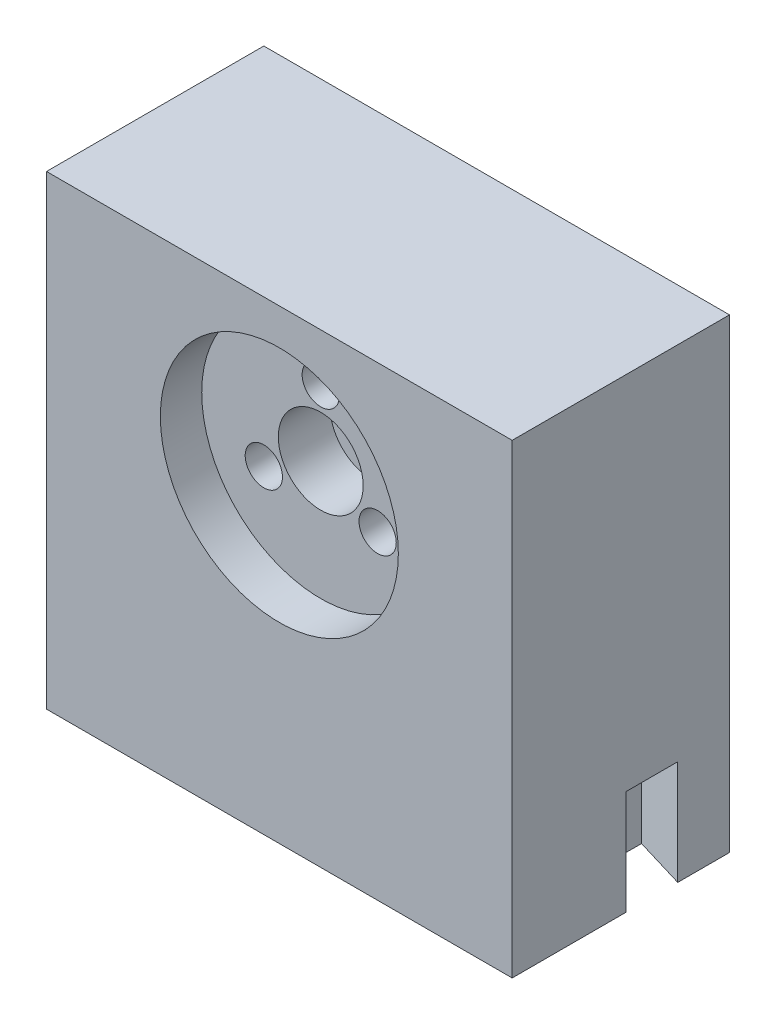
ISO-10303-21;
HEADER;
FILE_DESCRIPTION(('STEP AP214'),'2;1');
FILE_NAME('part.step','',(''),(''),'','','');
FILE_SCHEMA(('AUTOMOTIVE_DESIGN { 1 0 10303 214 1 1 1 1 }'));
ENDSEC;
DATA;
#1=APPLICATION_CONTEXT('core data for automotive mechanical design processes');
#2=APPLICATION_PROTOCOL_DEFINITION('international standard','automotive_design',2000,#1);
#3=PRODUCT_CONTEXT('',#1,'mechanical');
#4=PRODUCT('Part','Part','',(#3));
#5=PRODUCT_RELATED_PRODUCT_CATEGORY('part','',(#4));
#6=PRODUCT_DEFINITION_FORMATION('','',#4);
#7=PRODUCT_DEFINITION_CONTEXT('part definition',#1,'design');
#8=PRODUCT_DEFINITION('design','',#6,#7);
#9=PRODUCT_DEFINITION_SHAPE('','',#8);
#10=(LENGTH_UNIT() NAMED_UNIT(*) SI_UNIT(.MILLI.,.METRE.));
#11=(NAMED_UNIT(*) PLANE_ANGLE_UNIT() SI_UNIT($,.RADIAN.));
#12=(NAMED_UNIT(*) SI_UNIT($,.STERADIAN.) SOLID_ANGLE_UNIT());
#13=UNCERTAINTY_MEASURE_WITH_UNIT(LENGTH_MEASURE(1.E-05),#10,'distance_accuracy_value','');
#14=(GEOMETRIC_REPRESENTATION_CONTEXT(3) GLOBAL_UNCERTAINTY_ASSIGNED_CONTEXT((#13)) GLOBAL_UNIT_ASSIGNED_CONTEXT((#10,
#11,#12)) REPRESENTATION_CONTEXT('',''));
#15=CARTESIAN_POINT('',(0.,0.,0.));
#16=DIRECTION('',(0.,0.,1.));
#17=DIRECTION('',(1.,0.,0.));
#18=AXIS2_PLACEMENT_3D('',#15,#16,#17);
#19=CARTESIAN_POINT('',(22.5,30.,-2.50000000007189E-05));
#20=DIRECTION('',(0.,0.,1.));
#21=DIRECTION('',(1.,0.,0.));
#22=AXIS2_PLACEMENT_3D('',#19,#20,#21);
#23=CYLINDRICAL_SURFACE('',#22,2.6);
#24=CARTESIAN_POINT('',(22.5,30.,0.));
#25=DIRECTION('',(0.,0.,-1.));
#26=DIRECTION('',(-1.,0.,0.));
#27=AXIS2_PLACEMENT_3D('',#24,#25,#26);
#28=CIRCLE('',#27,2.6);
#29=CARTESIAN_POINT('',(19.9,30.,0.));
#30=VERTEX_POINT('',#29);
#31=EDGE_CURVE('E210',#30,#30,#28,.T.);
#32=ORIENTED_EDGE('',*,*,#31,.T.);
#33=EDGE_LOOP('',(#32));
#34=FACE_BOUND('',#33,.T.);
#35=CARTESIAN_POINT('',(22.5,30.,12.));
#36=DIRECTION('',(0.,0.,1.));
#37=DIRECTION('',(1.,0.,0.));
#38=AXIS2_PLACEMENT_3D('',#35,#36,#37);
#39=CIRCLE('',#38,2.6);
#40=CARTESIAN_POINT('',(25.1,30.,12.));
#41=VERTEX_POINT('',#40);
#42=EDGE_CURVE('E37',#41,#41,#39,.F.);
#43=ORIENTED_EDGE('',*,*,#42,.F.);
#44=EDGE_LOOP('',(#43));
#45=FACE_BOUND('',#44,.T.);
#46=ADVANCED_FACE('F33',(#34,#45),#23,.F.);
#47=CARTESIAN_POINT('',(22.5,36.35,-2.50000000007189E-05));
#48=DIRECTION('',(0.,0.,1.));
#49=DIRECTION('',(1.,0.,0.));
#50=AXIS2_PLACEMENT_3D('',#47,#48,#49);
#51=CYLINDRICAL_SURFACE('',#50,1.8);
#52=CARTESIAN_POINT('',(22.5,36.35,0.));
#53=DIRECTION('',(0.,0.,-1.));
#54=DIRECTION('',(-1.,0.,0.));
#55=AXIS2_PLACEMENT_3D('',#52,#53,#54);
#56=CIRCLE('',#55,1.8);
#57=CARTESIAN_POINT('',(20.7,36.35,0.));
#58=VERTEX_POINT('',#57);
#59=EDGE_CURVE('E267',#58,#58,#56,.T.);
#60=ORIENTED_EDGE('',*,*,#59,.T.);
#61=EDGE_LOOP('',(#60));
#62=FACE_BOUND('',#61,.T.);
#63=CARTESIAN_POINT('',(22.5,36.35,17.));
#64=DIRECTION('',(0.,0.,1.));
#65=DIRECTION('',(1.,0.,0.));
#66=AXIS2_PLACEMENT_3D('',#63,#64,#65);
#67=CIRCLE('',#66,1.8);
#68=CARTESIAN_POINT('',(24.3,36.35,17.));
#69=VERTEX_POINT('',#68);
#70=EDGE_CURVE('E247',#69,#69,#67,.F.);
#71=ORIENTED_EDGE('',*,*,#70,.F.);
#72=EDGE_LOOP('',(#71));
#73=FACE_BOUND('',#72,.T.);
#74=ADVANCED_FACE('F468',(#62,#73),#51,.F.);
#75=CARTESIAN_POINT('',(27.9992613140314,26.8250000000001,-2.50000000007189E-05));
#76=DIRECTION('',(0.,0.,1.));
#77=DIRECTION('',(1.,0.,0.));
#78=AXIS2_PLACEMENT_3D('',#75,#76,#77);
#79=CYLINDRICAL_SURFACE('',#78,1.8);
#80=CARTESIAN_POINT('',(27.9992613140314,26.8250000000001,0.));
#81=DIRECTION('',(0.,0.,-1.));
#82=DIRECTION('',(-1.,0.,0.));
#83=AXIS2_PLACEMENT_3D('',#80,#81,#82);
#84=CIRCLE('',#83,1.8);
#85=CARTESIAN_POINT('',(26.1992613140314,26.8250000000001,0.));
#86=VERTEX_POINT('',#85);
#87=EDGE_CURVE('E265',#86,#86,#84,.T.);
#88=ORIENTED_EDGE('',*,*,#87,.T.);
#89=EDGE_LOOP('',(#88));
#90=FACE_BOUND('',#89,.T.);
#91=CARTESIAN_POINT('',(27.9992613140314,26.8250000000001,17.));
#92=DIRECTION('',(0.,0.,1.));
#93=DIRECTION('',(1.,0.,0.));
#94=AXIS2_PLACEMENT_3D('',#91,#92,#93);
#95=CIRCLE('',#94,1.8);
#96=CARTESIAN_POINT('',(29.7992613140314,26.8250000000001,17.));
#97=VERTEX_POINT('',#96);
#98=EDGE_CURVE('E242',#97,#97,#95,.F.);
#99=ORIENTED_EDGE('',*,*,#98,.F.);
#100=EDGE_LOOP('',(#99));
#101=FACE_BOUND('',#100,.T.);
#102=ADVANCED_FACE('F473',(#90,#101),#79,.F.);
#103=CARTESIAN_POINT('',(17.000738685969,26.8249999999999,-2.50000000007189E-05));
#104=DIRECTION('',(0.,0.,1.));
#105=DIRECTION('',(1.,0.,0.));
#106=AXIS2_PLACEMENT_3D('',#103,#104,#105);
#107=CYLINDRICAL_SURFACE('',#106,1.8);
#108=CARTESIAN_POINT('',(17.000738685969,26.8249999999999,0.));
#109=DIRECTION('',(0.,0.,-1.));
#110=DIRECTION('',(-1.,0.,0.));
#111=AXIS2_PLACEMENT_3D('',#108,#109,#110);
#112=CIRCLE('',#111,1.8);
#113=CARTESIAN_POINT('',(15.200738685969,26.8249999999999,0.));
#114=VERTEX_POINT('',#113);
#115=EDGE_CURVE('E262',#114,#114,#112,.T.);
#116=ORIENTED_EDGE('',*,*,#115,.T.);
#117=EDGE_LOOP('',(#116));
#118=FACE_BOUND('',#117,.T.);
#119=CARTESIAN_POINT('',(17.000738685969,26.8249999999999,17.));
#120=DIRECTION('',(0.,0.,1.));
#121=DIRECTION('',(1.,0.,0.));
#122=AXIS2_PLACEMENT_3D('',#119,#120,#121);
#123=CIRCLE('',#122,1.8);
#124=CARTESIAN_POINT('',(18.800738685969,26.8249999999999,17.));
#125=VERTEX_POINT('',#124);
#126=EDGE_CURVE('E240',#125,#125,#123,.F.);
#127=ORIENTED_EDGE('',*,*,#126,.F.);
#128=EDGE_LOOP('',(#127));
#129=FACE_BOUND('',#128,.T.);
#130=ADVANCED_FACE('F478',(#118,#129),#107,.F.);
#131=CARTESIAN_POINT('',(0.,0.,15.));
#132=DIRECTION('',(1.,0.,0.));
#133=DIRECTION('',(0.,0.,-1.));
#134=AXIS2_PLACEMENT_3D('',#131,#132,#133);
#135=PLANE('',#134);
#136=DIRECTION('',(0.,-1.,0.));
#137=VECTOR('',#136,1.);
#138=CARTESIAN_POINT('',(0.,10.1,10.));
#139=LINE('',#138,#137);
#140=CARTESIAN_POINT('',(0.,10.1,10.));
#141=VERTEX_POINT('',#140);
#142=CARTESIAN_POINT('',(0.,0.,10.));
#143=VERTEX_POINT('',#142);
#144=EDGE_CURVE('E50',#141,#143,#139,.T.);
#145=ORIENTED_EDGE('',*,*,#144,.T.);
#146=DIRECTION('',(0.,0.,-1.));
#147=VECTOR('',#146,1.);
#148=CARTESIAN_POINT('',(0.,0.,15.));
#149=LINE('',#148,#147);
#150=CARTESIAN_POINT('',(0.,0.,21.));
#151=VERTEX_POINT('',#150);
#152=EDGE_CURVE('E11',#151,#143,#149,.T.);
#153=ORIENTED_EDGE('',*,*,#152,.F.);
#154=DIRECTION('',(0.,-1.,0.));
#155=VECTOR('',#154,1.);
#156=CARTESIAN_POINT('',(0.,45.,21.));
#157=LINE('',#156,#155);
#158=CARTESIAN_POINT('',(0.,45.,21.));
#159=VERTEX_POINT('',#158);
#160=EDGE_CURVE('E188',#159,#151,#157,.T.);
#161=ORIENTED_EDGE('',*,*,#160,.F.);
#162=DIRECTION('',(0.,0.,-1.));
#163=VECTOR('',#162,1.);
#164=CARTESIAN_POINT('',(0.,45.,15.));
#165=LINE('',#164,#163);
#166=CARTESIAN_POINT('',(0.,45.,0.));
#167=VERTEX_POINT('',#166);
#168=EDGE_CURVE('E316',#159,#167,#165,.T.);
#169=ORIENTED_EDGE('',*,*,#168,.T.);
#170=DIRECTION('',(0.,-1.,0.));
#171=VECTOR('',#170,1.);
#172=CARTESIAN_POINT('',(0.,0.,0.));
#173=LINE('',#172,#171);
#174=CARTESIAN_POINT('',(0.,0.,0.));
#175=VERTEX_POINT('',#174);
#176=EDGE_CURVE('E311',#167,#175,#173,.T.);
#177=ORIENTED_EDGE('',*,*,#176,.T.);
#178=CARTESIAN_POINT('',(0.,0.,5.));
#179=VERTEX_POINT('',#178);
#180=EDGE_CURVE('E42',#179,#175,#149,.T.);
#181=ORIENTED_EDGE('',*,*,#180,.F.);
#182=DIRECTION('',(0.,-1.,0.));
#183=VECTOR('',#182,1.);
#184=CARTESIAN_POINT('',(0.,10.1,5.));
#185=LINE('',#184,#183);
#186=CARTESIAN_POINT('',(0.,10.1,5.));
#187=VERTEX_POINT('',#186);
#188=EDGE_CURVE('E402',#187,#179,#185,.T.);
#189=ORIENTED_EDGE('',*,*,#188,.F.);
#190=DIRECTION('',(0.,0.,1.));
#191=VECTOR('',#190,1.);
#192=CARTESIAN_POINT('',(0.,10.1,10.));
#193=LINE('',#192,#191);
#194=EDGE_CURVE('E393',#187,#141,#193,.T.);
#195=ORIENTED_EDGE('',*,*,#194,.T.);
#196=EDGE_LOOP('',(#145,#153,#161,#169,#177,#181,#189,#195));
#197=FACE_BOUND('',#196,.T.);
#198=ADVANCED_FACE('F35',(#197),#135,.F.);
#199=CARTESIAN_POINT('',(0.,0.,15.));
#200=DIRECTION('',(0.,1.,0.));
#201=DIRECTION('',(0.,0.,1.));
#202=AXIS2_PLACEMENT_3D('',#199,#200,#201);
#203=PLANE('',#202);
#204=DIRECTION('',(0.,0.,-1.));
#205=VECTOR('',#204,1.);
#206=CARTESIAN_POINT('',(45.,0.,15.));
#207=LINE('',#206,#205);
#208=CARTESIAN_POINT('',(45.,0.,21.));
#209=VERTEX_POINT('',#208);
#210=CARTESIAN_POINT('',(45.,0.,10.));
#211=VERTEX_POINT('',#210);
#212=EDGE_CURVE('E197',#209,#211,#207,.T.);
#213=ORIENTED_EDGE('',*,*,#212,.F.);
#214=DIRECTION('',(1.,0.,0.));
#215=VECTOR('',#214,1.);
#216=CARTESIAN_POINT('',(0.,0.,21.));
#217=LINE('',#216,#215);
#218=EDGE_CURVE('E193',#151,#209,#217,.T.);
#219=ORIENTED_EDGE('',*,*,#218,.F.);
#220=ORIENTED_EDGE('',*,*,#152,.T.);
#221=DIRECTION('',(0.957826285221152,0.,0.287347885566346));
#222=VECTOR('',#221,1.);
#223=CARTESIAN_POINT('',(0.,0.,10.));
#224=LINE('',#223,#222);
#225=CARTESIAN_POINT('',(5.,0.,11.5));
#226=VERTEX_POINT('',#225);
#227=EDGE_CURVE('E396',#143,#226,#224,.T.);
#228=ORIENTED_EDGE('',*,*,#227,.T.);
#229=DIRECTION('',(0.,0.,-1.));
#230=VECTOR('',#229,1.);
#231=CARTESIAN_POINT('',(5.,0.,11.5));
#232=LINE('',#231,#230);
#233=CARTESIAN_POINT('',(5.,0.,3.5));
#234=VERTEX_POINT('',#233);
#235=EDGE_CURVE('E404',#226,#234,#232,.T.);
#236=ORIENTED_EDGE('',*,*,#235,.T.);
#237=DIRECTION('',(-0.957826285221151,0.,0.287347885566346));
#238=VECTOR('',#237,1.);
#239=CARTESIAN_POINT('',(5.,0.,3.5));
#240=LINE('',#239,#238);
#241=EDGE_CURVE('E387',#234,#179,#240,.T.);
#242=ORIENTED_EDGE('',*,*,#241,.T.);
#243=ORIENTED_EDGE('',*,*,#180,.T.);
#244=DIRECTION('',(1.,0.,0.));
#245=VECTOR('',#244,1.);
#246=CARTESIAN_POINT('',(0.,0.,0.));
#247=LINE('',#246,#245);
#248=CARTESIAN_POINT('',(14.5,0.,0.));
#249=VERTEX_POINT('',#248);
#250=EDGE_CURVE('E290',#175,#249,#247,.T.);
#251=ORIENTED_EDGE('',*,*,#250,.T.);
#252=DIRECTION('',(0.,0.,1.));
#253=VECTOR('',#252,1.);
#254=CARTESIAN_POINT('',(14.5,0.,0.));
#255=LINE('',#254,#253);
#256=CARTESIAN_POINT('',(14.5,0.,15.));
#257=VERTEX_POINT('',#256);
#258=EDGE_CURVE('E302',#249,#257,#255,.T.);
#259=ORIENTED_EDGE('',*,*,#258,.T.);
#260=DIRECTION('',(1.,0.,0.));
#261=VECTOR('',#260,1.);
#262=CARTESIAN_POINT('',(0.,0.,15.));
#263=LINE('',#262,#261);
#264=CARTESIAN_POINT('',(4.99999999999998,0.,15.));
#265=VERTEX_POINT('',#264);
#266=EDGE_CURVE('E386',#265,#257,#263,.T.);
#267=ORIENTED_EDGE('',*,*,#266,.F.);
#268=DIRECTION('',(0.,0.,1.));
#269=VECTOR('',#268,1.);
#270=CARTESIAN_POINT('',(4.99999999999999,0.,-34.4974746830583));
#271=LINE('',#270,#269);
#272=CARTESIAN_POINT('',(4.99999999999998,0.,18.));
#273=VERTEX_POINT('',#272);
#274=EDGE_CURVE('E230',#265,#273,#271,.T.);
#275=ORIENTED_EDGE('',*,*,#274,.T.);
#276=DIRECTION('',(1.,0.,0.));
#277=VECTOR('',#276,1.);
#278=CARTESIAN_POINT('',(0.,0.,18.));
#279=LINE('',#278,#277);
#280=CARTESIAN_POINT('',(40.,0.,18.));
#281=VERTEX_POINT('',#280);
#282=EDGE_CURVE('E207',#273,#281,#279,.T.);
#283=ORIENTED_EDGE('',*,*,#282,.T.);
#284=DIRECTION('',(0.,0.,1.));
#285=VECTOR('',#284,1.);
#286=CARTESIAN_POINT('',(40.,0.,-34.4974746830583));
#287=LINE('',#286,#285);
#288=CARTESIAN_POINT('',(40.,0.,15.));
#289=VERTEX_POINT('',#288);
#290=EDGE_CURVE('E234',#281,#289,#287,.F.);
#291=ORIENTED_EDGE('',*,*,#290,.T.);
#292=CARTESIAN_POINT('',(30.5,0.,15.));
#293=VERTEX_POINT('',#292);
#294=EDGE_CURVE('E233',#293,#289,#263,.T.);
#295=ORIENTED_EDGE('',*,*,#294,.F.);
#296=DIRECTION('',(0.,0.,1.));
#297=VECTOR('',#296,1.);
#298=CARTESIAN_POINT('',(30.5,0.,0.));
#299=LINE('',#298,#297);
#300=CARTESIAN_POINT('',(30.5,0.,0.));
#301=VERTEX_POINT('',#300);
#302=EDGE_CURVE('E330',#301,#293,#299,.T.);
#303=ORIENTED_EDGE('',*,*,#302,.F.);
#304=CARTESIAN_POINT('',(45.,0.,0.));
#305=VERTEX_POINT('',#304);
#306=EDGE_CURVE('E306',#301,#305,#247,.T.);
#307=ORIENTED_EDGE('',*,*,#306,.T.);
#308=CARTESIAN_POINT('',(45.,0.,5.));
#309=VERTEX_POINT('',#308);
#310=EDGE_CURVE('E321',#309,#305,#207,.T.);
#311=ORIENTED_EDGE('',*,*,#310,.F.);
#312=DIRECTION('',(0.957826285221151,0.,0.287347885566346));
#313=VECTOR('',#312,1.);
#314=CARTESIAN_POINT('',(40.,0.,3.5));
#315=LINE('',#314,#313);
#316=CARTESIAN_POINT('',(40.,0.,3.5));
#317=VERTEX_POINT('',#316);
#318=EDGE_CURVE('E418',#317,#309,#315,.T.);
#319=ORIENTED_EDGE('',*,*,#318,.F.);
#320=DIRECTION('',(0.,0.,-1.));
#321=VECTOR('',#320,1.);
#322=CARTESIAN_POINT('',(40.,0.,11.5));
#323=LINE('',#322,#321);
#324=CARTESIAN_POINT('',(40.,0.,11.5));
#325=VERTEX_POINT('',#324);
#326=EDGE_CURVE('E427',#325,#317,#323,.T.);
#327=ORIENTED_EDGE('',*,*,#326,.F.);
#328=DIRECTION('',(-0.957826285221152,0.,0.287347885566346));
#329=VECTOR('',#328,1.);
#330=CARTESIAN_POINT('',(45.,0.,10.));
#331=LINE('',#330,#329);
#332=EDGE_CURVE('E409',#211,#325,#331,.T.);
#333=ORIENTED_EDGE('',*,*,#332,.F.);
#334=EDGE_LOOP('',(#213,#219,#220,#228,#236,#242,#243,#251,#259,#267,#275,#283,#291,#295,#303,
#307,#311,#319,#327,#333));
#335=FACE_BOUND('',#334,.T.);
#336=ADVANCED_FACE('F194',(#335),#203,.F.);
#337=CARTESIAN_POINT('',(45.,0.,15.));
#338=DIRECTION('',(-1.,0.,0.));
#339=DIRECTION('',(0.,0.,1.));
#340=AXIS2_PLACEMENT_3D('',#337,#338,#339);
#341=PLANE('',#340);
#342=DIRECTION('',(0.,0.,1.));
#343=VECTOR('',#342,1.);
#344=CARTESIAN_POINT('',(45.,10.1,10.));
#345=LINE('',#344,#343);
#346=CARTESIAN_POINT('',(45.,10.1,5.));
#347=VERTEX_POINT('',#346);
#348=CARTESIAN_POINT('',(45.,10.1,10.));
#349=VERTEX_POINT('',#348);
#350=EDGE_CURVE('E415',#347,#349,#345,.T.);
#351=ORIENTED_EDGE('',*,*,#350,.F.);
#352=DIRECTION('',(0.,-1.,0.));
#353=VECTOR('',#352,1.);
#354=CARTESIAN_POINT('',(45.,10.1,5.));
#355=LINE('',#354,#353);
#356=EDGE_CURVE('E338',#347,#309,#355,.T.);
#357=ORIENTED_EDGE('',*,*,#356,.T.);
#358=ORIENTED_EDGE('',*,*,#310,.T.);
#359=DIRECTION('',(0.,1.,0.));
#360=VECTOR('',#359,1.);
#361=CARTESIAN_POINT('',(45.,0.,0.));
#362=LINE('',#361,#360);
#363=CARTESIAN_POINT('',(45.,45.,0.));
#364=VERTEX_POINT('',#363);
#365=EDGE_CURVE('E305',#305,#364,#362,.T.);
#366=ORIENTED_EDGE('',*,*,#365,.T.);
#367=DIRECTION('',(0.,0.,-1.));
#368=VECTOR('',#367,1.);
#369=CARTESIAN_POINT('',(45.,45.,15.));
#370=LINE('',#369,#368);
#371=CARTESIAN_POINT('',(45.,45.,21.));
#372=VERTEX_POINT('',#371);
#373=EDGE_CURVE('E318',#372,#364,#370,.T.);
#374=ORIENTED_EDGE('',*,*,#373,.F.);
#375=DIRECTION('',(0.,1.,0.));
#376=VECTOR('',#375,1.);
#377=CARTESIAN_POINT('',(45.,45.,21.));
#378=LINE('',#377,#376);
#379=EDGE_CURVE('E201',#209,#372,#378,.T.);
#380=ORIENTED_EDGE('',*,*,#379,.F.);
#381=ORIENTED_EDGE('',*,*,#212,.T.);
#382=DIRECTION('',(0.,-1.,0.));
#383=VECTOR('',#382,1.);
#384=CARTESIAN_POINT('',(45.,10.1,10.));
#385=LINE('',#384,#383);
#386=EDGE_CURVE('E424',#349,#211,#385,.T.);
#387=ORIENTED_EDGE('',*,*,#386,.F.);
#388=EDGE_LOOP('',(#351,#357,#358,#366,#374,#380,#381,#387));
#389=FACE_BOUND('',#388,.T.);
#390=ADVANCED_FACE('F572',(#389),#341,.F.);
#391=CARTESIAN_POINT('',(0.,45.,15.));
#392=DIRECTION('',(0.,-1.,0.));
#393=DIRECTION('',(0.,0.,-1.));
#394=AXIS2_PLACEMENT_3D('',#391,#392,#393);
#395=PLANE('',#394);
#396=DIRECTION('',(-1.,0.,0.));
#397=VECTOR('',#396,1.);
#398=CARTESIAN_POINT('',(0.,45.,0.));
#399=LINE('',#398,#397);
#400=EDGE_CURVE('E308',#364,#167,#399,.T.);
#401=ORIENTED_EDGE('',*,*,#400,.T.);
#402=ORIENTED_EDGE('',*,*,#168,.F.);
#403=DIRECTION('',(-1.,0.,0.));
#404=VECTOR('',#403,1.);
#405=CARTESIAN_POINT('',(0.,45.,21.));
#406=LINE('',#405,#404);
#407=EDGE_CURVE('E206',#372,#159,#406,.T.);
#408=ORIENTED_EDGE('',*,*,#407,.F.);
#409=ORIENTED_EDGE('',*,*,#373,.T.);
#410=EDGE_LOOP('',(#401,#402,#408,#409));
#411=FACE_BOUND('',#410,.T.);
#412=ADVANCED_FACE('F280',(#411),#395,.F.);
#413=CARTESIAN_POINT('',(0.,0.,0.));
#414=DIRECTION('',(0.,0.,-1.));
#415=DIRECTION('',(-1.,0.,0.));
#416=AXIS2_PLACEMENT_3D('',#413,#414,#415);
#417=PLANE('',#416);
#418=ORIENTED_EDGE('',*,*,#115,.F.);
#419=EDGE_LOOP('',(#418));
#420=FACE_BOUND('',#419,.T.);
#421=ORIENTED_EDGE('',*,*,#87,.F.);
#422=EDGE_LOOP('',(#421));
#423=FACE_BOUND('',#422,.T.);
#424=ORIENTED_EDGE('',*,*,#59,.F.);
#425=EDGE_LOOP('',(#424));
#426=FACE_BOUND('',#425,.T.);
#427=ORIENTED_EDGE('',*,*,#31,.F.);
#428=EDGE_LOOP('',(#427));
#429=FACE_BOUND('',#428,.T.);
#430=DIRECTION('',(0.,-1.,0.));
#431=VECTOR('',#430,1.);
#432=CARTESIAN_POINT('',(14.5,0.,0.));
#433=LINE('',#432,#431);
#434=CARTESIAN_POINT('',(14.5,1.99999999999999,0.));
#435=VERTEX_POINT('',#434);
#436=EDGE_CURVE('E287',#435,#249,#433,.T.);
#437=ORIENTED_EDGE('',*,*,#436,.T.);
#438=ORIENTED_EDGE('',*,*,#250,.F.);
#439=ORIENTED_EDGE('',*,*,#176,.F.);
#440=ORIENTED_EDGE('',*,*,#400,.F.);
#441=ORIENTED_EDGE('',*,*,#365,.F.);
#442=ORIENTED_EDGE('',*,*,#306,.F.);
#443=DIRECTION('',(0.,1.,0.));
#444=VECTOR('',#443,1.);
#445=CARTESIAN_POINT('',(30.5,0.,0.));
#446=LINE('',#445,#444);
#447=CARTESIAN_POINT('',(30.5,2.,0.));
#448=VERTEX_POINT('',#447);
#449=EDGE_CURVE('E297',#301,#448,#446,.T.);
#450=ORIENTED_EDGE('',*,*,#449,.T.);
#451=DIRECTION('',(-1.,0.,0.));
#452=VECTOR('',#451,1.);
#453=CARTESIAN_POINT('',(23.5,1.99999999999999,0.));
#454=LINE('',#453,#452);
#455=CARTESIAN_POINT('',(23.5,1.99999999999999,0.));
#456=VERTEX_POINT('',#455);
#457=EDGE_CURVE('E374',#448,#456,#454,.T.);
#458=ORIENTED_EDGE('',*,*,#457,.T.);
#459=DIRECTION('',(0.,1.,0.));
#460=VECTOR('',#459,1.);
#461=CARTESIAN_POINT('',(23.5,1.99999999999999,0.));
#462=LINE('',#461,#460);
#463=CARTESIAN_POINT('',(23.5,9.99999999999999,0.));
#464=VERTEX_POINT('',#463);
#465=EDGE_CURVE('E440',#456,#464,#462,.T.);
#466=ORIENTED_EDGE('',*,*,#465,.T.);
#467=DIRECTION('',(-1.,0.,0.));
#468=VECTOR('',#467,1.);
#469=CARTESIAN_POINT('',(21.5,9.99999999999999,0.));
#470=LINE('',#469,#468);
#471=CARTESIAN_POINT('',(21.5,9.99999999999999,0.));
#472=VERTEX_POINT('',#471);
#473=EDGE_CURVE('E443',#464,#472,#470,.T.);
#474=ORIENTED_EDGE('',*,*,#473,.T.);
#475=DIRECTION('',(0.,-1.,0.));
#476=VECTOR('',#475,1.);
#477=CARTESIAN_POINT('',(21.5,1.99999999999999,0.));
#478=LINE('',#477,#476);
#479=CARTESIAN_POINT('',(21.5,1.99999999999999,0.));
#480=VERTEX_POINT('',#479);
#481=EDGE_CURVE('E445',#472,#480,#478,.T.);
#482=ORIENTED_EDGE('',*,*,#481,.T.);
#483=DIRECTION('',(-1.,0.,0.));
#484=VECTOR('',#483,1.);
#485=CARTESIAN_POINT('',(14.5,1.99999999999999,0.));
#486=LINE('',#485,#484);
#487=EDGE_CURVE('E294',#480,#435,#486,.T.);
#488=ORIENTED_EDGE('',*,*,#487,.T.);
#489=EDGE_LOOP('',(#437,#438,#439,#440,#441,#442,#450,#458,#466,#474,#482,#488));
#490=FACE_BOUND('',#489,.T.);
#491=ADVANCED_FACE('F276',(#420,#423,#426,#429,#490),#417,.T.);
#492=CARTESIAN_POINT('',(14.5,0.,0.));
#493=DIRECTION('',(-1.,0.,0.));
#494=DIRECTION('',(0.,0.,1.));
#495=AXIS2_PLACEMENT_3D('',#492,#493,#494);
#496=PLANE('',#495);
#497=DIRECTION('',(0.,-1.,0.));
#498=VECTOR('',#497,1.);
#499=CARTESIAN_POINT('',(14.5,0.,15.));
#500=LINE('',#499,#498);
#501=CARTESIAN_POINT('',(14.5,1.99999999999999,15.));
#502=VERTEX_POINT('',#501);
#503=EDGE_CURVE('E327',#502,#257,#500,.T.);
#504=ORIENTED_EDGE('',*,*,#503,.T.);
#505=ORIENTED_EDGE('',*,*,#258,.F.);
#506=ORIENTED_EDGE('',*,*,#436,.F.);
#507=DIRECTION('',(0.,0.,1.));
#508=VECTOR('',#507,1.);
#509=CARTESIAN_POINT('',(14.5,1.99999999999999,0.));
#510=LINE('',#509,#508);
#511=EDGE_CURVE('E356',#435,#502,#510,.T.);
#512=ORIENTED_EDGE('',*,*,#511,.T.);
#513=EDGE_LOOP('',(#504,#505,#506,#512));
#514=FACE_BOUND('',#513,.T.);
#515=ADVANCED_FACE('F279',(#514),#496,.F.);
#516=CARTESIAN_POINT('',(14.5,1.99999999999999,0.));
#517=DIRECTION('',(0.,1.,0.));
#518=DIRECTION('',(-1.,0.,0.));
#519=AXIS2_PLACEMENT_3D('',#516,#517,#518);
#520=PLANE('',#519);
#521=DIRECTION('',(-1.,0.,0.));
#522=VECTOR('',#521,1.);
#523=CARTESIAN_POINT('',(14.5,1.99999999999999,15.));
#524=LINE('',#523,#522);
#525=CARTESIAN_POINT('',(21.5,1.99999999999999,15.));
#526=VERTEX_POINT('',#525);
#527=EDGE_CURVE('E298',#526,#502,#524,.T.);
#528=ORIENTED_EDGE('',*,*,#527,.T.);
#529=ORIENTED_EDGE('',*,*,#511,.F.);
#530=ORIENTED_EDGE('',*,*,#487,.F.);
#531=DIRECTION('',(0.,0.,1.));
#532=VECTOR('',#531,1.);
#533=CARTESIAN_POINT('',(21.5,1.99999999999999,0.));
#534=LINE('',#533,#532);
#535=EDGE_CURVE('E358',#480,#526,#534,.T.);
#536=ORIENTED_EDGE('',*,*,#535,.T.);
#537=EDGE_LOOP('',(#528,#529,#530,#536));
#538=FACE_BOUND('',#537,.T.);
#539=ADVANCED_FACE('F451',(#538),#520,.F.);
#540=CARTESIAN_POINT('',(21.5,1.99999999999999,0.));
#541=DIRECTION('',(-1.,0.,0.));
#542=DIRECTION('',(0.,0.,1.));
#543=AXIS2_PLACEMENT_3D('',#540,#541,#542);
#544=PLANE('',#543);
#545=DIRECTION('',(0.,-1.,0.));
#546=VECTOR('',#545,1.);
#547=CARTESIAN_POINT('',(21.5,1.99999999999999,15.));
#548=LINE('',#547,#546);
#549=CARTESIAN_POINT('',(21.5,9.99999999999999,15.));
#550=VERTEX_POINT('',#549);
#551=EDGE_CURVE('E351',#550,#526,#548,.T.);
#552=ORIENTED_EDGE('',*,*,#551,.T.);
#553=ORIENTED_EDGE('',*,*,#535,.F.);
#554=ORIENTED_EDGE('',*,*,#481,.F.);
#555=DIRECTION('',(0.,0.,1.));
#556=VECTOR('',#555,1.);
#557=CARTESIAN_POINT('',(21.5,9.99999999999999,0.));
#558=LINE('',#557,#556);
#559=EDGE_CURVE('E361',#472,#550,#558,.T.);
#560=ORIENTED_EDGE('',*,*,#559,.T.);
#561=EDGE_LOOP('',(#552,#553,#554,#560));
#562=FACE_BOUND('',#561,.T.);
#563=ADVANCED_FACE('F449',(#562),#544,.F.);
#564=CARTESIAN_POINT('',(21.5,9.99999999999999,0.));
#565=DIRECTION('',(0.,1.,0.));
#566=DIRECTION('',(-1.,0.,0.));
#567=AXIS2_PLACEMENT_3D('',#564,#565,#566);
#568=PLANE('',#567);
#569=DIRECTION('',(-1.,0.,0.));
#570=VECTOR('',#569,1.);
#571=CARTESIAN_POINT('',(21.5,9.99999999999999,15.));
#572=LINE('',#571,#570);
#573=CARTESIAN_POINT('',(23.5,9.99999999999999,15.));
#574=VERTEX_POINT('',#573);
#575=EDGE_CURVE('E348',#574,#550,#572,.T.);
#576=ORIENTED_EDGE('',*,*,#575,.T.);
#577=ORIENTED_EDGE('',*,*,#559,.F.);
#578=ORIENTED_EDGE('',*,*,#473,.F.);
#579=DIRECTION('',(0.,0.,1.));
#580=VECTOR('',#579,1.);
#581=CARTESIAN_POINT('',(23.5,9.99999999999999,0.));
#582=LINE('',#581,#580);
#583=EDGE_CURVE('E364',#464,#574,#582,.T.);
#584=ORIENTED_EDGE('',*,*,#583,.T.);
#585=EDGE_LOOP('',(#576,#577,#578,#584));
#586=FACE_BOUND('',#585,.T.);
#587=ADVANCED_FACE('F649',(#586),#568,.F.);
#588=CARTESIAN_POINT('',(23.5,1.99999999999999,0.));
#589=DIRECTION('',(1.,0.,0.));
#590=DIRECTION('',(0.,0.,-1.));
#591=AXIS2_PLACEMENT_3D('',#588,#589,#590);
#592=PLANE('',#591);
#593=DIRECTION('',(0.,1.,0.));
#594=VECTOR('',#593,1.);
#595=CARTESIAN_POINT('',(23.5,1.99999999999999,15.));
#596=LINE('',#595,#594);
#597=CARTESIAN_POINT('',(23.5,1.99999999999999,15.));
#598=VERTEX_POINT('',#597);
#599=EDGE_CURVE('E345',#598,#574,#596,.T.);
#600=ORIENTED_EDGE('',*,*,#599,.T.);
#601=ORIENTED_EDGE('',*,*,#583,.F.);
#602=ORIENTED_EDGE('',*,*,#465,.F.);
#603=DIRECTION('',(0.,0.,1.));
#604=VECTOR('',#603,1.);
#605=CARTESIAN_POINT('',(23.5,1.99999999999999,0.));
#606=LINE('',#605,#604);
#607=EDGE_CURVE('E367',#456,#598,#606,.T.);
#608=ORIENTED_EDGE('',*,*,#607,.T.);
#609=EDGE_LOOP('',(#600,#601,#602,#608));
#610=FACE_BOUND('',#609,.T.);
#611=ADVANCED_FACE('F640',(#610),#592,.F.);
#612=CARTESIAN_POINT('',(23.5,1.99999999999999,0.));
#613=DIRECTION('',(0.,1.,0.));
#614=DIRECTION('',(-1.,0.,0.));
#615=AXIS2_PLACEMENT_3D('',#612,#613,#614);
#616=PLANE('',#615);
#617=DIRECTION('',(-1.,0.,0.));
#618=VECTOR('',#617,1.);
#619=CARTESIAN_POINT('',(23.5,1.99999999999999,15.));
#620=LINE('',#619,#618);
#621=CARTESIAN_POINT('',(30.5,2.,15.));
#622=VERTEX_POINT('',#621);
#623=EDGE_CURVE('E326',#622,#598,#620,.T.);
#624=ORIENTED_EDGE('',*,*,#623,.T.);
#625=ORIENTED_EDGE('',*,*,#607,.F.);
#626=ORIENTED_EDGE('',*,*,#457,.F.);
#627=DIRECTION('',(0.,0.,1.));
#628=VECTOR('',#627,1.);
#629=CARTESIAN_POINT('',(30.5,2.,0.));
#630=LINE('',#629,#628);
#631=EDGE_CURVE('E333',#448,#622,#630,.T.);
#632=ORIENTED_EDGE('',*,*,#631,.T.);
#633=EDGE_LOOP('',(#624,#625,#626,#632));
#634=FACE_BOUND('',#633,.T.);
#635=ADVANCED_FACE('F372',(#634),#616,.F.);
#636=CARTESIAN_POINT('',(30.5,0.,0.));
#637=DIRECTION('',(1.,0.,0.));
#638=DIRECTION('',(0.,0.,-1.));
#639=AXIS2_PLACEMENT_3D('',#636,#637,#638);
#640=PLANE('',#639);
#641=DIRECTION('',(0.,1.,0.));
#642=VECTOR('',#641,1.);
#643=CARTESIAN_POINT('',(30.5,0.,15.));
#644=LINE('',#643,#642);
#645=EDGE_CURVE('E323',#293,#622,#644,.T.);
#646=ORIENTED_EDGE('',*,*,#645,.T.);
#647=ORIENTED_EDGE('',*,*,#631,.F.);
#648=ORIENTED_EDGE('',*,*,#449,.F.);
#649=ORIENTED_EDGE('',*,*,#302,.T.);
#650=EDGE_LOOP('',(#646,#647,#648,#649));
#651=FACE_BOUND('',#650,.T.);
#652=ADVANCED_FACE('F377',(#651),#640,.F.);
#653=CARTESIAN_POINT('',(40.,10.1,3.5));
#654=DIRECTION('',(0.287347885566346,0.,-0.957826285221151));
#655=DIRECTION('',(-0.957826285221151,0.,-0.287347885566346));
#656=AXIS2_PLACEMENT_3D('',#653,#654,#655);
#657=PLANE('',#656);
#658=ORIENTED_EDGE('',*,*,#318,.T.);
#659=ORIENTED_EDGE('',*,*,#356,.F.);
#660=DIRECTION('',(0.957826285221151,0.,0.287347885566346));
#661=VECTOR('',#660,1.);
#662=CARTESIAN_POINT('',(40.,10.1,3.5));
#663=LINE('',#662,#661);
#664=CARTESIAN_POINT('',(40.,10.1,3.5));
#665=VERTEX_POINT('',#664);
#666=EDGE_CURVE('E58',#665,#347,#663,.T.);
#667=ORIENTED_EDGE('',*,*,#666,.F.);
#668=DIRECTION('',(0.,-1.,0.));
#669=VECTOR('',#668,1.);
#670=CARTESIAN_POINT('',(40.,10.1,3.5));
#671=LINE('',#670,#669);
#672=EDGE_CURVE('E433',#665,#317,#671,.T.);
#673=ORIENTED_EDGE('',*,*,#672,.T.);
#674=EDGE_LOOP('',(#658,#659,#667,#673));
#675=FACE_BOUND('',#674,.T.);
#676=ADVANCED_FACE('F629',(#675),#657,.F.);
#677=CARTESIAN_POINT('',(40.,10.1,11.5));
#678=DIRECTION('',(-1.,0.,0.));
#679=DIRECTION('',(0.,0.,1.));
#680=AXIS2_PLACEMENT_3D('',#677,#678,#679);
#681=PLANE('',#680);
#682=ORIENTED_EDGE('',*,*,#326,.T.);
#683=ORIENTED_EDGE('',*,*,#672,.F.);
#684=DIRECTION('',(0.,0.,-1.));
#685=VECTOR('',#684,1.);
#686=CARTESIAN_POINT('',(40.,10.1,11.5));
#687=LINE('',#686,#685);
#688=CARTESIAN_POINT('',(40.,10.1,11.5));
#689=VERTEX_POINT('',#688);
#690=EDGE_CURVE('E421',#689,#665,#687,.T.);
#691=ORIENTED_EDGE('',*,*,#690,.F.);
#692=DIRECTION('',(0.,-1.,0.));
#693=VECTOR('',#692,1.);
#694=CARTESIAN_POINT('',(40.,10.1,11.5));
#695=LINE('',#694,#693);
#696=EDGE_CURVE('E435',#689,#325,#695,.T.);
#697=ORIENTED_EDGE('',*,*,#696,.T.);
#698=EDGE_LOOP('',(#682,#683,#691,#697));
#699=FACE_BOUND('',#698,.T.);
#700=ADVANCED_FACE('F739',(#699),#681,.F.);
#701=CARTESIAN_POINT('',(45.,10.1,10.));
#702=DIRECTION('',(0.287347885566345,0.,0.957826285221151));
#703=DIRECTION('',(0.957826285221152,0.,-0.287347885566345));
#704=AXIS2_PLACEMENT_3D('',#701,#702,#703);
#705=PLANE('',#704);
#706=ORIENTED_EDGE('',*,*,#332,.T.);
#707=ORIENTED_EDGE('',*,*,#696,.F.);
#708=DIRECTION('',(-0.957826285221152,0.,0.287347885566346));
#709=VECTOR('',#708,1.);
#710=CARTESIAN_POINT('',(45.,10.1,10.));
#711=LINE('',#710,#709);
#712=EDGE_CURVE('E417',#349,#689,#711,.T.);
#713=ORIENTED_EDGE('',*,*,#712,.F.);
#714=ORIENTED_EDGE('',*,*,#386,.T.);
#715=EDGE_LOOP('',(#706,#707,#713,#714));
#716=FACE_BOUND('',#715,.T.);
#717=ADVANCED_FACE('F730',(#716),#705,.F.);
#718=CARTESIAN_POINT('',(0.,10.1,0.));
#719=DIRECTION('',(0.,-1.,0.));
#720=DIRECTION('',(0.,0.,-1.));
#721=AXIS2_PLACEMENT_3D('',#718,#719,#720);
#722=PLANE('',#721);
#723=ORIENTED_EDGE('',*,*,#350,.T.);
#724=ORIENTED_EDGE('',*,*,#712,.T.);
#725=ORIENTED_EDGE('',*,*,#690,.T.);
#726=ORIENTED_EDGE('',*,*,#666,.T.);
#727=EDGE_LOOP('',(#723,#724,#725,#726));
#728=FACE_BOUND('',#727,.T.);
#729=ADVANCED_FACE('F721',(#728),#722,.T.);
#730=CARTESIAN_POINT('',(0.,10.1,10.));
#731=DIRECTION('',(0.287347885566345,0.,-0.957826285221151));
#732=DIRECTION('',(-0.957826285221152,0.,-0.287347885566345));
#733=AXIS2_PLACEMENT_3D('',#730,#731,#732);
#734=PLANE('',#733);
#735=ORIENTED_EDGE('',*,*,#227,.F.);
#736=ORIENTED_EDGE('',*,*,#144,.F.);
#737=DIRECTION('',(0.957826285221152,0.,0.287347885566346));
#738=VECTOR('',#737,1.);
#739=CARTESIAN_POINT('',(0.,10.1,10.));
#740=LINE('',#739,#738);
#741=CARTESIAN_POINT('',(5.,10.1,11.5));
#742=VERTEX_POINT('',#741);
#743=EDGE_CURVE('E400',#141,#742,#740,.T.);
#744=ORIENTED_EDGE('',*,*,#743,.T.);
#745=DIRECTION('',(0.,-1.,0.));
#746=VECTOR('',#745,1.);
#747=CARTESIAN_POINT('',(5.,10.1,11.5));
#748=LINE('',#747,#746);
#749=EDGE_CURVE('E410',#742,#226,#748,.T.);
#750=ORIENTED_EDGE('',*,*,#749,.T.);
#751=EDGE_LOOP('',(#735,#736,#744,#750));
#752=FACE_BOUND('',#751,.T.);
#753=ADVANCED_FACE('F711',(#752),#734,.T.);
#754=CARTESIAN_POINT('',(5.,10.1,11.5));
#755=DIRECTION('',(-1.,0.,0.));
#756=DIRECTION('',(0.,0.,1.));
#757=AXIS2_PLACEMENT_3D('',#754,#755,#756);
#758=PLANE('',#757);
#759=ORIENTED_EDGE('',*,*,#235,.F.);
#760=ORIENTED_EDGE('',*,*,#749,.F.);
#761=DIRECTION('',(0.,0.,-1.));
#762=VECTOR('',#761,1.);
#763=CARTESIAN_POINT('',(5.,10.1,11.5));
#764=LINE('',#763,#762);
#765=CARTESIAN_POINT('',(5.,10.1,3.5));
#766=VERTEX_POINT('',#765);
#767=EDGE_CURVE('E398',#742,#766,#764,.T.);
#768=ORIENTED_EDGE('',*,*,#767,.T.);
#769=DIRECTION('',(0.,-1.,0.));
#770=VECTOR('',#769,1.);
#771=CARTESIAN_POINT('',(5.,10.1,3.5));
#772=LINE('',#771,#770);
#773=EDGE_CURVE('E412',#766,#234,#772,.T.);
#774=ORIENTED_EDGE('',*,*,#773,.T.);
#775=EDGE_LOOP('',(#759,#760,#768,#774));
#776=FACE_BOUND('',#775,.T.);
#777=ADVANCED_FACE('F701',(#776),#758,.T.);
#778=CARTESIAN_POINT('',(5.,10.1,3.5));
#779=DIRECTION('',(0.287347885566346,0.,0.957826285221151));
#780=DIRECTION('',(0.957826285221151,0.,-0.287347885566346));
#781=AXIS2_PLACEMENT_3D('',#778,#779,#780);
#782=PLANE('',#781);
#783=ORIENTED_EDGE('',*,*,#241,.F.);
#784=ORIENTED_EDGE('',*,*,#773,.F.);
#785=DIRECTION('',(-0.957826285221151,0.,0.287347885566346));
#786=VECTOR('',#785,1.);
#787=CARTESIAN_POINT('',(5.,10.1,3.5));
#788=LINE('',#787,#786);
#789=EDGE_CURVE('E395',#766,#187,#788,.T.);
#790=ORIENTED_EDGE('',*,*,#789,.T.);
#791=ORIENTED_EDGE('',*,*,#188,.T.);
#792=EDGE_LOOP('',(#783,#784,#790,#791));
#793=FACE_BOUND('',#792,.T.);
#794=ADVANCED_FACE('F691',(#793),#782,.T.);
#795=CARTESIAN_POINT('',(45.,10.1,0.));
#796=DIRECTION('',(0.,-1.,0.));
#797=DIRECTION('',(0.,0.,-1.));
#798=AXIS2_PLACEMENT_3D('',#795,#796,#797);
#799=PLANE('',#798);
#800=ORIENTED_EDGE('',*,*,#194,.F.);
#801=ORIENTED_EDGE('',*,*,#789,.F.);
#802=ORIENTED_EDGE('',*,*,#767,.F.);
#803=ORIENTED_EDGE('',*,*,#743,.F.);
#804=EDGE_LOOP('',(#800,#801,#802,#803));
#805=FACE_BOUND('',#804,.T.);
#806=ADVANCED_FACE('F620',(#805),#799,.T.);
#807=CARTESIAN_POINT('',(0.,0.,15.));
#808=DIRECTION('',(0.,0.,1.));
#809=DIRECTION('',(1.,0.,0.));
#810=AXIS2_PLACEMENT_3D('',#807,#808,#809);
#811=PLANE('',#810);
#812=ORIENTED_EDGE('',*,*,#266,.T.);
#813=ORIENTED_EDGE('',*,*,#503,.F.);
#814=ORIENTED_EDGE('',*,*,#527,.F.);
#815=ORIENTED_EDGE('',*,*,#551,.F.);
#816=ORIENTED_EDGE('',*,*,#575,.F.);
#817=ORIENTED_EDGE('',*,*,#599,.F.);
#818=ORIENTED_EDGE('',*,*,#623,.F.);
#819=ORIENTED_EDGE('',*,*,#645,.F.);
#820=ORIENTED_EDGE('',*,*,#294,.T.);
#821=CARTESIAN_POINT('',(22.5,0.,15.));
#822=DIRECTION('',(0.,0.,1.));
#823=DIRECTION('',(1.,0.,0.));
#824=AXIS2_PLACEMENT_3D('',#821,#822,#823);
#825=CIRCLE('',#824,17.5);
#826=EDGE_CURVE('E222',#265,#289,#825,.F.);
#827=ORIENTED_EDGE('',*,*,#826,.F.);
#828=EDGE_LOOP('',(#812,#813,#814,#815,#816,#817,#818,#819,#820,#827));
#829=FACE_BOUND('',#828,.T.);
#830=ADVANCED_FACE('F381',(#829),#811,.T.);
#831=CARTESIAN_POINT('',(22.5,0.,-34.4974746830583));
#832=DIRECTION('',(0.,0.,1.));
#833=DIRECTION('',(1.,0.,0.));
#834=AXIS2_PLACEMENT_3D('',#831,#832,#833);
#835=CYLINDRICAL_SURFACE('',#834,17.5);
#836=ORIENTED_EDGE('',*,*,#826,.T.);
#837=ORIENTED_EDGE('',*,*,#290,.F.);
#838=CARTESIAN_POINT('',(22.5,0.,18.));
#839=DIRECTION('',(0.,0.,1.));
#840=DIRECTION('',(1.,0.,0.));
#841=AXIS2_PLACEMENT_3D('',#838,#839,#840);
#842=CIRCLE('',#841,17.5);
#843=EDGE_CURVE('E217',#281,#273,#842,.T.);
#844=ORIENTED_EDGE('',*,*,#843,.T.);
#845=ORIENTED_EDGE('',*,*,#274,.F.);
#846=EDGE_LOOP('',(#836,#837,#844,#845));
#847=FACE_BOUND('',#846,.T.);
#848=ADVANCED_FACE('F453',(#847),#835,.F.);
#849=CARTESIAN_POINT('',(0.,0.,18.));
#850=DIRECTION('',(0.,0.,1.));
#851=DIRECTION('',(1.,0.,0.));
#852=AXIS2_PLACEMENT_3D('',#849,#850,#851);
#853=PLANE('',#852);
#854=ORIENTED_EDGE('',*,*,#843,.F.);
#855=ORIENTED_EDGE('',*,*,#282,.F.);
#856=EDGE_LOOP('',(#854,#855));
#857=FACE_BOUND('',#856,.T.);
#858=ADVANCED_FACE('F455',(#857),#853,.F.);
#859=CARTESIAN_POINT('',(0.,0.,21.));
#860=DIRECTION('',(0.,0.,1.));
#861=DIRECTION('',(1.,0.,0.));
#862=AXIS2_PLACEMENT_3D('',#859,#860,#861);
#863=PLANE('',#862);
#864=CARTESIAN_POINT('',(22.5,30.,21.));
#865=DIRECTION('',(0.,0.,1.));
#866=DIRECTION('',(1.,0.,0.));
#867=AXIS2_PLACEMENT_3D('',#864,#865,#866);
#868=CIRCLE('',#867,11.5);
#869=CARTESIAN_POINT('',(34.,30.,21.));
#870=VERTEX_POINT('',#869);
#871=EDGE_CURVE('E250',#870,#870,#868,.T.);
#872=ORIENTED_EDGE('',*,*,#871,.F.);
#873=EDGE_LOOP('',(#872));
#874=FACE_BOUND('',#873,.T.);
#875=ORIENTED_EDGE('',*,*,#160,.T.);
#876=ORIENTED_EDGE('',*,*,#218,.T.);
#877=ORIENTED_EDGE('',*,*,#379,.T.);
#878=ORIENTED_EDGE('',*,*,#407,.T.);
#879=EDGE_LOOP('',(#875,#876,#877,#878));
#880=FACE_BOUND('',#879,.T.);
#881=ADVANCED_FACE('F204',(#874,#880),#863,.T.);
#882=CARTESIAN_POINT('',(22.5,30.,17.));
#883=DIRECTION('',(0.,0.,1.));
#884=DIRECTION('',(1.,0.,0.));
#885=AXIS2_PLACEMENT_3D('',#882,#883,#884);
#886=PLANE('',#885);
#887=CARTESIAN_POINT('',(22.5,30.,17.));
#888=DIRECTION('',(0.,0.,1.));
#889=DIRECTION('',(1.,0.,0.));
#890=AXIS2_PLACEMENT_3D('',#887,#888,#889);
#891=CIRCLE('',#890,4.1);
#892=CARTESIAN_POINT('',(26.6,30.,17.));
#893=VERTEX_POINT('',#892);
#894=EDGE_CURVE('E257',#893,#893,#891,.T.);
#895=ORIENTED_EDGE('',*,*,#894,.F.);
#896=EDGE_LOOP('',(#895));
#897=FACE_BOUND('',#896,.T.);
#898=CARTESIAN_POINT('',(22.5,30.,17.));
#899=DIRECTION('',(0.,0.,1.));
#900=DIRECTION('',(1.,0.,0.));
#901=AXIS2_PLACEMENT_3D('',#898,#899,#900);
#902=CIRCLE('',#901,11.5);
#903=CARTESIAN_POINT('',(34.,30.,17.));
#904=VERTEX_POINT('',#903);
#905=EDGE_CURVE('E243',#904,#904,#902,.T.);
#906=ORIENTED_EDGE('',*,*,#905,.T.);
#907=EDGE_LOOP('',(#906));
#908=FACE_BOUND('',#907,.T.);
#909=ORIENTED_EDGE('',*,*,#126,.T.);
#910=EDGE_LOOP('',(#909));
#911=FACE_BOUND('',#910,.T.);
#912=ORIENTED_EDGE('',*,*,#98,.T.);
#913=EDGE_LOOP('',(#912));
#914=FACE_BOUND('',#913,.T.);
#915=ORIENTED_EDGE('',*,*,#70,.T.);
#916=EDGE_LOOP('',(#915));
#917=FACE_BOUND('',#916,.T.);
#918=ADVANCED_FACE('F462',(#897,#908,#911,#914,#917),#886,.T.);
#919=CARTESIAN_POINT('',(22.5,30.,17.));
#920=DIRECTION('',(0.,0.,1.));
#921=DIRECTION('',(1.,0.,0.));
#922=AXIS2_PLACEMENT_3D('',#919,#920,#921);
#923=CYLINDRICAL_SURFACE('',#922,11.5);
#924=ORIENTED_EDGE('',*,*,#905,.F.);
#925=EDGE_LOOP('',(#924));
#926=FACE_BOUND('',#925,.T.);
#927=ORIENTED_EDGE('',*,*,#871,.T.);
#928=EDGE_LOOP('',(#927));
#929=FACE_BOUND('',#928,.T.);
#930=ADVANCED_FACE('F483',(#926,#929),#923,.F.);
#931=CARTESIAN_POINT('',(22.5,30.,12.));
#932=DIRECTION('',(0.,0.,1.));
#933=DIRECTION('',(1.,0.,0.));
#934=AXIS2_PLACEMENT_3D('',#931,#932,#933);
#935=PLANE('',#934);
#936=CARTESIAN_POINT('',(22.5,30.,12.));
#937=DIRECTION('',(0.,0.,1.));
#938=DIRECTION('',(1.,0.,0.));
#939=AXIS2_PLACEMENT_3D('',#936,#937,#938);
#940=CIRCLE('',#939,4.1);
#941=CARTESIAN_POINT('',(26.6,30.,12.));
#942=VERTEX_POINT('',#941);
#943=EDGE_CURVE('E502',#942,#942,#940,.T.);
#944=ORIENTED_EDGE('',*,*,#943,.T.);
#945=EDGE_LOOP('',(#944));
#946=FACE_BOUND('',#945,.T.);
#947=ORIENTED_EDGE('',*,*,#42,.T.);
#948=EDGE_LOOP('',(#947));
#949=FACE_BOUND('',#948,.T.);
#950=ADVANCED_FACE('F486',(#946,#949),#935,.T.);
#951=CARTESIAN_POINT('',(22.5,30.,12.));
#952=DIRECTION('',(0.,0.,1.));
#953=DIRECTION('',(1.,0.,0.));
#954=AXIS2_PLACEMENT_3D('',#951,#952,#953);
#955=CYLINDRICAL_SURFACE('',#954,4.1);
#956=ORIENTED_EDGE('',*,*,#943,.F.);
#957=EDGE_LOOP('',(#956));
#958=FACE_BOUND('',#957,.T.);
#959=ORIENTED_EDGE('',*,*,#894,.T.);
#960=EDGE_LOOP('',(#959));
#961=FACE_BOUND('',#960,.T.);
#962=ADVANCED_FACE('F491',(#958,#961),#955,.F.);
#963=CLOSED_SHELL('',(#46,#74,#102,#130,#198,#336,#390,#412,#491,#515,#539,#563,#587,#611,#635,
#652,#676,#700,#717,#729,#753,#777,#794,#806,#830,#848,#858,#881,#918,#930,#950,#962));
#964=MANIFOLD_SOLID_BREP('B2',#963);
#965=ADVANCED_BREP_SHAPE_REPRESENTATION('',(#18,#964),#14);
#966=SHAPE_DEFINITION_REPRESENTATION(#9,#965);
ENDSEC;
END-ISO-10303-21;
